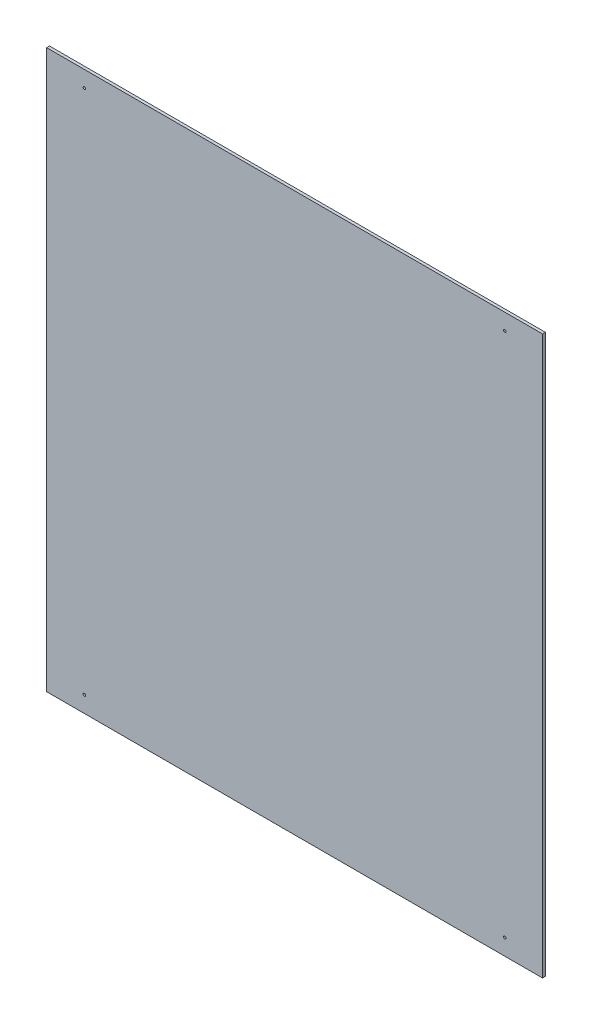
ISO-10303-21;
HEADER;
FILE_DESCRIPTION(('STEP AP214'),'2;1');
FILE_NAME('part.step','',(''),(''),'','','');
FILE_SCHEMA(('AUTOMOTIVE_DESIGN { 1 0 10303 214 1 1 1 1 }'));
ENDSEC;
DATA;
#1=APPLICATION_CONTEXT('core data for automotive mechanical design processes');
#2=APPLICATION_PROTOCOL_DEFINITION('international standard','automotive_design',2000,#1);
#3=PRODUCT_CONTEXT('',#1,'mechanical');
#4=PRODUCT('Part','Part','',(#3));
#5=PRODUCT_RELATED_PRODUCT_CATEGORY('part','',(#4));
#6=PRODUCT_DEFINITION_FORMATION('','',#4);
#7=PRODUCT_DEFINITION_CONTEXT('part definition',#1,'design');
#8=PRODUCT_DEFINITION('design','',#6,#7);
#9=PRODUCT_DEFINITION_SHAPE('','',#8);
#10=(LENGTH_UNIT() NAMED_UNIT(*) SI_UNIT(.MILLI.,.METRE.));
#11=(NAMED_UNIT(*) PLANE_ANGLE_UNIT() SI_UNIT($,.RADIAN.));
#12=(NAMED_UNIT(*) SI_UNIT($,.STERADIAN.) SOLID_ANGLE_UNIT());
#13=UNCERTAINTY_MEASURE_WITH_UNIT(LENGTH_MEASURE(1.E-05),#10,'distance_accuracy_value','');
#14=(GEOMETRIC_REPRESENTATION_CONTEXT(3) GLOBAL_UNCERTAINTY_ASSIGNED_CONTEXT((#13)) GLOBAL_UNIT_ASSIGNED_CONTEXT((#10,
#11,#12)) REPRESENTATION_CONTEXT('',''));
#15=CARTESIAN_POINT('',(0.,0.,0.));
#16=DIRECTION('',(0.,0.,1.));
#17=DIRECTION('',(1.,0.,0.));
#18=AXIS2_PLACEMENT_3D('',#15,#16,#17);
#19=CARTESIAN_POINT('',(-200.,-225.,-2.3));
#20=DIRECTION('',(-1.,0.,0.));
#21=DIRECTION('',(0.,0.,1.));
#22=AXIS2_PLACEMENT_3D('',#19,#20,#21);
#23=PLANE('',#22);
#24=DIRECTION('',(0.,-1.,0.));
#25=VECTOR('',#24,1.);
#26=CARTESIAN_POINT('',(-200.,-225.,0.));
#27=LINE('',#26,#25);
#28=CARTESIAN_POINT('',(-200.,225.,0.));
#29=VERTEX_POINT('',#28);
#30=CARTESIAN_POINT('',(-200.,-225.,0.));
#31=VERTEX_POINT('',#30);
#32=EDGE_CURVE('E104',#29,#31,#27,.T.);
#33=ORIENTED_EDGE('',*,*,#32,.F.);
#34=DIRECTION('',(0.,0.,1.));
#35=VECTOR('',#34,1.);
#36=CARTESIAN_POINT('',(-200.,225.,-2.3));
#37=LINE('',#36,#35);
#38=CARTESIAN_POINT('',(-200.,225.,-2.3));
#39=VERTEX_POINT('',#38);
#40=EDGE_CURVE('E11',#39,#29,#37,.T.);
#41=ORIENTED_EDGE('',*,*,#40,.F.);
#42=DIRECTION('',(0.,-1.,0.));
#43=VECTOR('',#42,1.);
#44=CARTESIAN_POINT('',(-200.,-225.,-2.3));
#45=LINE('',#44,#43);
#46=CARTESIAN_POINT('',(-200.,-225.,-2.3));
#47=VERTEX_POINT('',#46);
#48=EDGE_CURVE('E97',#39,#47,#45,.T.);
#49=ORIENTED_EDGE('',*,*,#48,.T.);
#50=DIRECTION('',(0.,0.,1.));
#51=VECTOR('',#50,1.);
#52=CARTESIAN_POINT('',(-200.,-225.,-2.3));
#53=LINE('',#52,#51);
#54=EDGE_CURVE('E42',#47,#31,#53,.T.);
#55=ORIENTED_EDGE('',*,*,#54,.T.);
#56=EDGE_LOOP('',(#33,#41,#49,#55));
#57=FACE_BOUND('',#56,.T.);
#58=ADVANCED_FACE('F39',(#57),#23,.T.);
#59=CARTESIAN_POINT('',(200.,225.,-2.3));
#60=DIRECTION('',(0.,1.,0.));
#61=DIRECTION('',(-1.,0.,0.));
#62=AXIS2_PLACEMENT_3D('',#59,#60,#61);
#63=PLANE('',#62);
#64=DIRECTION('',(-1.,0.,0.));
#65=VECTOR('',#64,1.);
#66=CARTESIAN_POINT('',(200.,225.,0.));
#67=LINE('',#66,#65);
#68=CARTESIAN_POINT('',(200.,225.,0.));
#69=VERTEX_POINT('',#68);
#70=EDGE_CURVE('E99',#69,#29,#67,.T.);
#71=ORIENTED_EDGE('',*,*,#70,.F.);
#72=DIRECTION('',(0.,0.,1.));
#73=VECTOR('',#72,1.);
#74=CARTESIAN_POINT('',(200.,225.,-2.3));
#75=LINE('',#74,#73);
#76=CARTESIAN_POINT('',(200.,225.,-2.3));
#77=VERTEX_POINT('',#76);
#78=EDGE_CURVE('E48',#77,#69,#75,.T.);
#79=ORIENTED_EDGE('',*,*,#78,.F.);
#80=DIRECTION('',(-1.,0.,0.));
#81=VECTOR('',#80,1.);
#82=CARTESIAN_POINT('',(200.,225.,-2.3));
#83=LINE('',#82,#81);
#84=EDGE_CURVE('E94',#77,#39,#83,.T.);
#85=ORIENTED_EDGE('',*,*,#84,.T.);
#86=ORIENTED_EDGE('',*,*,#40,.T.);
#87=EDGE_LOOP('',(#71,#79,#85,#86));
#88=FACE_BOUND('',#87,.T.);
#89=ADVANCED_FACE('F115',(#88),#63,.T.);
#90=CARTESIAN_POINT('',(200.,-225.,-2.3));
#91=DIRECTION('',(1.,0.,0.));
#92=DIRECTION('',(0.,0.,-1.));
#93=AXIS2_PLACEMENT_3D('',#90,#91,#92);
#94=PLANE('',#93);
#95=DIRECTION('',(0.,1.,0.));
#96=VECTOR('',#95,1.);
#97=CARTESIAN_POINT('',(200.,-225.,0.));
#98=LINE('',#97,#96);
#99=CARTESIAN_POINT('',(200.,-225.,0.));
#100=VERTEX_POINT('',#99);
#101=EDGE_CURVE('E89',#100,#69,#98,.T.);
#102=ORIENTED_EDGE('',*,*,#101,.F.);
#103=DIRECTION('',(0.,0.,1.));
#104=VECTOR('',#103,1.);
#105=CARTESIAN_POINT('',(200.,-225.,-2.3));
#106=LINE('',#105,#104);
#107=CARTESIAN_POINT('',(200.,-225.,-2.3));
#108=VERTEX_POINT('',#107);
#109=EDGE_CURVE('E84',#108,#100,#106,.T.);
#110=ORIENTED_EDGE('',*,*,#109,.F.);
#111=DIRECTION('',(0.,1.,0.));
#112=VECTOR('',#111,1.);
#113=CARTESIAN_POINT('',(200.,-225.,-2.3));
#114=LINE('',#113,#112);
#115=EDGE_CURVE('E87',#108,#77,#114,.T.);
#116=ORIENTED_EDGE('',*,*,#115,.T.);
#117=ORIENTED_EDGE('',*,*,#78,.T.);
#118=EDGE_LOOP('',(#102,#110,#116,#117));
#119=FACE_BOUND('',#118,.T.);
#120=ADVANCED_FACE('F86',(#119),#94,.T.);
#121=CARTESIAN_POINT('',(200.,-225.,-2.3));
#122=DIRECTION('',(0.,-1.,0.));
#123=DIRECTION('',(1.,0.,0.));
#124=AXIS2_PLACEMENT_3D('',#121,#122,#123);
#125=PLANE('',#124);
#126=DIRECTION('',(1.,0.,0.));
#127=VECTOR('',#126,1.);
#128=CARTESIAN_POINT('',(200.,-225.,0.));
#129=LINE('',#128,#127);
#130=EDGE_CURVE('E107',#31,#100,#129,.T.);
#131=ORIENTED_EDGE('',*,*,#130,.F.);
#132=ORIENTED_EDGE('',*,*,#54,.F.);
#133=DIRECTION('',(1.,0.,0.));
#134=VECTOR('',#133,1.);
#135=CARTESIAN_POINT('',(200.,-225.,-2.3));
#136=LINE('',#135,#134);
#137=EDGE_CURVE('E93',#47,#108,#136,.T.);
#138=ORIENTED_EDGE('',*,*,#137,.T.);
#139=ORIENTED_EDGE('',*,*,#109,.T.);
#140=EDGE_LOOP('',(#131,#132,#138,#139));
#141=FACE_BOUND('',#140,.T.);
#142=ADVANCED_FACE('F96',(#141),#125,.T.);
#143=CARTESIAN_POINT('',(0.,0.,-2.3));
#144=DIRECTION('',(0.,0.,1.));
#145=DIRECTION('',(1.,0.,0.));
#146=AXIS2_PLACEMENT_3D('',#143,#144,#145);
#147=PLANE('',#146);
#148=CARTESIAN_POINT('',(-169.61,211.94,-2.3));
#149=DIRECTION('',(0.,0.,-1.));
#150=DIRECTION('',(-1.,0.,0.));
#151=AXIS2_PLACEMENT_3D('',#148,#149,#150);
#152=CIRCLE('',#151,0.999999999999998);
#153=CARTESIAN_POINT('',(-170.61,211.94,-2.3));
#154=VERTEX_POINT('',#153);
#155=EDGE_CURVE('E156',#154,#154,#152,.T.);
#156=ORIENTED_EDGE('',*,*,#155,.F.);
#157=EDGE_LOOP('',(#156));
#158=FACE_BOUND('',#157,.T.);
#159=CARTESIAN_POINT('',(-169.61,-211.94,-2.3));
#160=DIRECTION('',(0.,0.,1.));
#161=DIRECTION('',(-1.,0.,0.));
#162=AXIS2_PLACEMENT_3D('',#159,#160,#161);
#163=CIRCLE('',#162,0.999999999999998);
#164=CARTESIAN_POINT('',(-170.61,-211.94,-2.3));
#165=VERTEX_POINT('',#164);
#166=EDGE_CURVE('E164',#165,#165,#163,.T.);
#167=ORIENTED_EDGE('',*,*,#166,.T.);
#168=EDGE_LOOP('',(#167));
#169=FACE_BOUND('',#168,.T.);
#170=CARTESIAN_POINT('',(169.61,-211.94,-2.3));
#171=DIRECTION('',(0.,0.,-1.));
#172=DIRECTION('',(1.,0.,0.));
#173=AXIS2_PLACEMENT_3D('',#170,#171,#172);
#174=CIRCLE('',#173,0.999999999999998);
#175=CARTESIAN_POINT('',(170.61,-211.94,-2.3));
#176=VERTEX_POINT('',#175);
#177=EDGE_CURVE('E170',#176,#176,#174,.T.);
#178=ORIENTED_EDGE('',*,*,#177,.F.);
#179=EDGE_LOOP('',(#178));
#180=FACE_BOUND('',#179,.T.);
#181=CARTESIAN_POINT('',(169.61,211.94,-2.3));
#182=DIRECTION('',(0.,0.,1.));
#183=DIRECTION('',(1.,0.,0.));
#184=AXIS2_PLACEMENT_3D('',#181,#182,#183);
#185=CIRCLE('',#184,0.999999999999998);
#186=CARTESIAN_POINT('',(170.61,211.94,-2.3));
#187=VERTEX_POINT('',#186);
#188=EDGE_CURVE('E108',#187,#187,#185,.T.);
#189=ORIENTED_EDGE('',*,*,#188,.T.);
#190=EDGE_LOOP('',(#189));
#191=FACE_BOUND('',#190,.T.);
#192=ORIENTED_EDGE('',*,*,#48,.F.);
#193=ORIENTED_EDGE('',*,*,#84,.F.);
#194=ORIENTED_EDGE('',*,*,#115,.F.);
#195=ORIENTED_EDGE('',*,*,#137,.F.);
#196=EDGE_LOOP('',(#192,#193,#194,#195));
#197=FACE_BOUND('',#196,.T.);
#198=ADVANCED_FACE('F92',(#158,#169,#180,#191,#197),#147,.F.);
#199=CARTESIAN_POINT('',(0.,0.,0.));
#200=DIRECTION('',(0.,0.,1.));
#201=DIRECTION('',(1.,0.,0.));
#202=AXIS2_PLACEMENT_3D('',#199,#200,#201);
#203=PLANE('',#202);
#204=CARTESIAN_POINT('',(-169.61,211.94,0.));
#205=DIRECTION('',(0.,0.,-1.));
#206=DIRECTION('',(-1.,0.,0.));
#207=AXIS2_PLACEMENT_3D('',#204,#205,#206);
#208=CIRCLE('',#207,0.999999999999998);
#209=CARTESIAN_POINT('',(-170.61,211.94,0.));
#210=VERTEX_POINT('',#209);
#211=EDGE_CURVE('E159',#210,#210,#208,.T.);
#212=ORIENTED_EDGE('',*,*,#211,.T.);
#213=EDGE_LOOP('',(#212));
#214=FACE_BOUND('',#213,.T.);
#215=CARTESIAN_POINT('',(-169.61,-211.94,0.));
#216=DIRECTION('',(0.,0.,1.));
#217=DIRECTION('',(-1.,0.,0.));
#218=AXIS2_PLACEMENT_3D('',#215,#216,#217);
#219=CIRCLE('',#218,0.999999999999998);
#220=CARTESIAN_POINT('',(-170.61,-211.94,0.));
#221=VERTEX_POINT('',#220);
#222=EDGE_CURVE('E161',#221,#221,#219,.T.);
#223=ORIENTED_EDGE('',*,*,#222,.F.);
#224=EDGE_LOOP('',(#223));
#225=FACE_BOUND('',#224,.T.);
#226=CARTESIAN_POINT('',(169.61,-211.94,0.));
#227=DIRECTION('',(0.,0.,-1.));
#228=DIRECTION('',(1.,0.,0.));
#229=AXIS2_PLACEMENT_3D('',#226,#227,#228);
#230=CIRCLE('',#229,0.999999999999998);
#231=CARTESIAN_POINT('',(170.61,-211.94,0.));
#232=VERTEX_POINT('',#231);
#233=EDGE_CURVE('E167',#232,#232,#230,.T.);
#234=ORIENTED_EDGE('',*,*,#233,.T.);
#235=EDGE_LOOP('',(#234));
#236=FACE_BOUND('',#235,.T.);
#237=CARTESIAN_POINT('',(169.61,211.94,0.));
#238=DIRECTION('',(0.,0.,1.));
#239=DIRECTION('',(1.,0.,0.));
#240=AXIS2_PLACEMENT_3D('',#237,#238,#239);
#241=CIRCLE('',#240,0.999999999999998);
#242=CARTESIAN_POINT('',(170.61,211.94,0.));
#243=VERTEX_POINT('',#242);
#244=EDGE_CURVE('E173',#243,#243,#241,.T.);
#245=ORIENTED_EDGE('',*,*,#244,.F.);
#246=EDGE_LOOP('',(#245));
#247=FACE_BOUND('',#246,.T.);
#248=ORIENTED_EDGE('',*,*,#32,.T.);
#249=ORIENTED_EDGE('',*,*,#130,.T.);
#250=ORIENTED_EDGE('',*,*,#101,.T.);
#251=ORIENTED_EDGE('',*,*,#70,.T.);
#252=EDGE_LOOP('',(#248,#249,#250,#251));
#253=FACE_BOUND('',#252,.T.);
#254=ADVANCED_FACE('F114',(#214,#225,#236,#247,#253),#203,.T.);
#255=CARTESIAN_POINT('',(169.61,211.94,-2.3));
#256=DIRECTION('',(0.,0.,1.));
#257=DIRECTION('',(1.,0.,0.));
#258=AXIS2_PLACEMENT_3D('',#255,#256,#257);
#259=CYLINDRICAL_SURFACE('',#258,0.999999999999998);
#260=ORIENTED_EDGE('',*,*,#188,.F.);
#261=EDGE_LOOP('',(#260));
#262=FACE_BOUND('',#261,.T.);
#263=ORIENTED_EDGE('',*,*,#244,.T.);
#264=EDGE_LOOP('',(#263));
#265=FACE_BOUND('',#264,.T.);
#266=ADVANCED_FACE('F133',(#262,#265),#259,.F.);
#267=CARTESIAN_POINT('',(169.61,-211.94,-2.3));
#268=DIRECTION('',(0.,0.,1.));
#269=DIRECTION('',(1.,0.,0.));
#270=AXIS2_PLACEMENT_3D('',#267,#268,#269);
#271=CYLINDRICAL_SURFACE('',#270,0.999999999999998);
#272=ORIENTED_EDGE('',*,*,#177,.T.);
#273=EDGE_LOOP('',(#272));
#274=FACE_BOUND('',#273,.T.);
#275=ORIENTED_EDGE('',*,*,#233,.F.);
#276=EDGE_LOOP('',(#275));
#277=FACE_BOUND('',#276,.T.);
#278=ADVANCED_FACE('F140',(#274,#277),#271,.F.);
#279=CARTESIAN_POINT('',(-169.61,-211.94,-2.3));
#280=DIRECTION('',(0.,0.,1.));
#281=DIRECTION('',(1.,0.,0.));
#282=AXIS2_PLACEMENT_3D('',#279,#280,#281);
#283=CYLINDRICAL_SURFACE('',#282,0.999999999999998);
#284=ORIENTED_EDGE('',*,*,#166,.F.);
#285=EDGE_LOOP('',(#284));
#286=FACE_BOUND('',#285,.T.);
#287=ORIENTED_EDGE('',*,*,#222,.T.);
#288=EDGE_LOOP('',(#287));
#289=FACE_BOUND('',#288,.T.);
#290=ADVANCED_FACE('F144',(#286,#289),#283,.F.);
#291=CARTESIAN_POINT('',(-169.61,211.94,-2.3));
#292=DIRECTION('',(0.,0.,1.));
#293=DIRECTION('',(1.,0.,0.));
#294=AXIS2_PLACEMENT_3D('',#291,#292,#293);
#295=CYLINDRICAL_SURFACE('',#294,0.999999999999998);
#296=ORIENTED_EDGE('',*,*,#155,.T.);
#297=EDGE_LOOP('',(#296));
#298=FACE_BOUND('',#297,.T.);
#299=ORIENTED_EDGE('',*,*,#211,.F.);
#300=EDGE_LOOP('',(#299));
#301=FACE_BOUND('',#300,.T.);
#302=ADVANCED_FACE('F148',(#298,#301),#295,.F.);
#303=CLOSED_SHELL('',(#58,#89,#120,#142,#198,#254,#266,#278,#290,#302));
#304=MANIFOLD_SOLID_BREP('B2',#303);
#305=ADVANCED_BREP_SHAPE_REPRESENTATION('',(#18,#304),#14);
#306=SHAPE_DEFINITION_REPRESENTATION(#9,#305);
ENDSEC;
END-ISO-10303-21;
